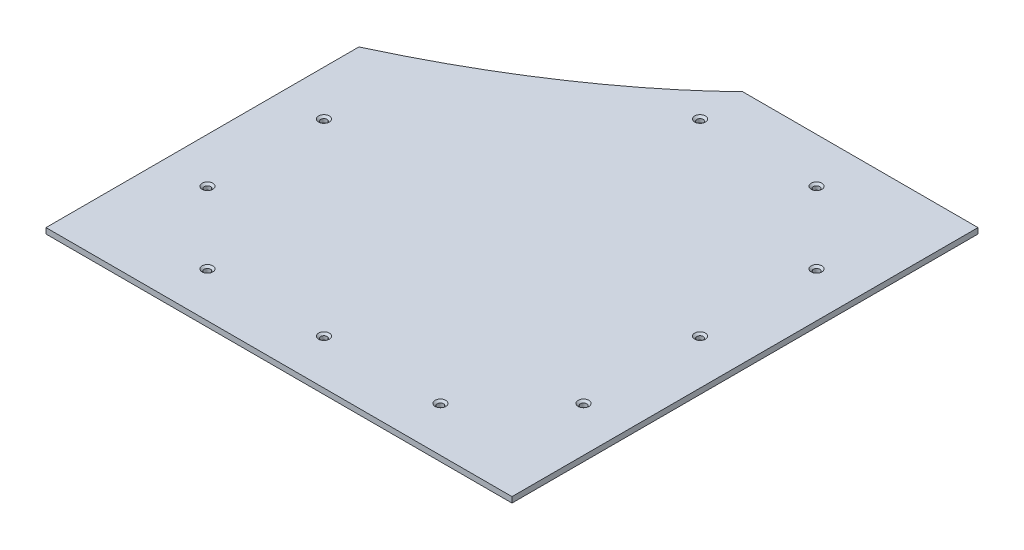
ISO-10303-21;
HEADER;
FILE_DESCRIPTION(('STEP AP214'),'2;1');
FILE_NAME('part.step','',(''),(''),'','','');
FILE_SCHEMA(('AUTOMOTIVE_DESIGN { 1 0 10303 214 1 1 1 1 }'));
ENDSEC;
DATA;
#1=APPLICATION_CONTEXT('core data for automotive mechanical design processes');
#2=APPLICATION_PROTOCOL_DEFINITION('international standard','automotive_design',2000,#1);
#3=PRODUCT_CONTEXT('',#1,'mechanical');
#4=PRODUCT('Part','Part','',(#3));
#5=PRODUCT_RELATED_PRODUCT_CATEGORY('part','',(#4));
#6=PRODUCT_DEFINITION_FORMATION('','',#4);
#7=PRODUCT_DEFINITION_CONTEXT('part definition',#1,'design');
#8=PRODUCT_DEFINITION('design','',#6,#7);
#9=PRODUCT_DEFINITION_SHAPE('','',#8);
#10=(LENGTH_UNIT() NAMED_UNIT(*) SI_UNIT(.MILLI.,.METRE.));
#11=(NAMED_UNIT(*) PLANE_ANGLE_UNIT() SI_UNIT($,.RADIAN.));
#12=(NAMED_UNIT(*) SI_UNIT($,.STERADIAN.) SOLID_ANGLE_UNIT());
#13=UNCERTAINTY_MEASURE_WITH_UNIT(LENGTH_MEASURE(1.E-05),#10,'distance_accuracy_value','');
#14=(GEOMETRIC_REPRESENTATION_CONTEXT(3) GLOBAL_UNCERTAINTY_ASSIGNED_CONTEXT((#13)) GLOBAL_UNIT_ASSIGNED_CONTEXT((#10,
#11,#12)) REPRESENTATION_CONTEXT('',''));
#15=CARTESIAN_POINT('',(0.,0.,0.));
#16=DIRECTION('',(0.,0.,1.));
#17=DIRECTION('',(1.,0.,0.));
#18=AXIS2_PLACEMENT_3D('',#15,#16,#17);
#19=CARTESIAN_POINT('',(65.821179,76.933679,65.821179));
#20=DIRECTION('',(1.,0.,0.));
#21=DIRECTION('',(0.,0.,1.));
#22=AXIS2_PLACEMENT_3D('',#19,#20,#21);
#23=PLANE('',#22);
#24=DIRECTION('',(0.,0.,1.));
#25=VECTOR('',#24,1.);
#26=CARTESIAN_POINT('',(65.821179,75.346179,65.821179));
#27=LINE('',#26,#25);
#28=CARTESIAN_POINT('',(65.821179,75.346179,-65.821179));
#29=VERTEX_POINT('',#28);
#30=CARTESIAN_POINT('',(65.821179,75.346179,65.821179));
#31=VERTEX_POINT('',#30);
#32=EDGE_CURVE('E103',#29,#31,#27,.T.);
#33=ORIENTED_EDGE('',*,*,#32,.F.);
#34=DIRECTION('',(0.,-1.,0.));
#35=VECTOR('',#34,1.);
#36=CARTESIAN_POINT('',(65.821179,76.933679,-65.821179));
#37=LINE('',#36,#35);
#38=CARTESIAN_POINT('',(65.821179,76.933679,-65.821179));
#39=VERTEX_POINT('',#38);
#40=EDGE_CURVE('E39',#39,#29,#37,.T.);
#41=ORIENTED_EDGE('',*,*,#40,.F.);
#42=DIRECTION('',(0.,0.,1.));
#43=VECTOR('',#42,1.);
#44=CARTESIAN_POINT('',(65.821179,76.933679,65.821179));
#45=LINE('',#44,#43);
#46=CARTESIAN_POINT('',(65.821179,76.933679,65.821179));
#47=VERTEX_POINT('',#46);
#48=EDGE_CURVE('E101',#39,#47,#45,.T.);
#49=ORIENTED_EDGE('',*,*,#48,.T.);
#50=DIRECTION('',(0.,-1.,0.));
#51=VECTOR('',#50,1.);
#52=CARTESIAN_POINT('',(65.821179,76.933679,65.821179));
#53=LINE('',#52,#51);
#54=EDGE_CURVE('E76',#47,#31,#53,.T.);
#55=ORIENTED_EDGE('',*,*,#54,.T.);
#56=EDGE_LOOP('',(#33,#41,#49,#55));
#57=FACE_BOUND('',#56,.T.);
#58=ADVANCED_FACE('F32',(#57),#23,.T.);
#59=CARTESIAN_POINT('',(65.821179,76.933679,-65.821179));
#60=DIRECTION('',(0.,0.,-1.));
#61=DIRECTION('',(1.,0.,0.));
#62=AXIS2_PLACEMENT_3D('',#59,#60,#61);
#63=PLANE('',#62);
#64=CARTESIAN_POINT('',(-78.4121172748223,76.165561457065,-65.821179));
#65=DIRECTION('',(0.,0.,-1.));
#66=DIRECTION('',(0.896707047194472,0.442624526559217,0.));
#67=AXIS2_PLACEMENT_3D('',#64,#65,#66);
#68=ELLIPSE('',#67,107.554363776842,44.45);
#69=CARTESIAN_POINT('',(-0.660591825935017,76.933679,-65.821179));
#70=VERTEX_POINT('',#69);
#71=CARTESIAN_POINT('',(-2.22918076828221,75.346179,-65.821179));
#72=VERTEX_POINT('',#71);
#73=EDGE_CURVE('E46',#70,#72,#68,.T.);
#74=ORIENTED_EDGE('',*,*,#73,.F.);
#75=DIRECTION('',(1.,0.,0.));
#76=VECTOR('',#75,1.);
#77=CARTESIAN_POINT('',(65.821179,76.933679,-65.821179));
#78=LINE('',#77,#76);
#79=EDGE_CURVE('E53',#70,#39,#78,.T.);
#80=ORIENTED_EDGE('',*,*,#79,.T.);
#81=ORIENTED_EDGE('',*,*,#40,.T.);
#82=DIRECTION('',(1.,0.,0.));
#83=VECTOR('',#82,1.);
#84=CARTESIAN_POINT('',(65.821179,75.346179,-65.821179));
#85=LINE('',#84,#83);
#86=EDGE_CURVE('E71',#72,#29,#85,.T.);
#87=ORIENTED_EDGE('',*,*,#86,.F.);
#88=EDGE_LOOP('',(#74,#80,#81,#87));
#89=FACE_BOUND('',#88,.T.);
#90=ADVANCED_FACE('F132',(#89),#63,.T.);
#91=CARTESIAN_POINT('',(-65.821179,76.933679,65.821179));
#92=DIRECTION('',(-1.,0.,0.));
#93=DIRECTION('',(0.,0.,-1.));
#94=AXIS2_PLACEMENT_3D('',#91,#92,#93);
#95=PLANE('',#94);
#96=CARTESIAN_POINT('',(-65.821179,82.3805879925049,-72.1938508100711));
#97=DIRECTION('',(-1.,0.,0.));
#98=DIRECTION('',(0.,0.698196395740358,-0.715906273876108));
#99=AXIS2_PLACEMENT_3D('',#96,#97,#98);
#100=ELLIPSE('',#99,54.4366628705828,44.45);
#101=CARTESIAN_POINT('',(-65.821179,75.346179,-22.4609990980805));
#102=VERTEX_POINT('',#101);
#103=CARTESIAN_POINT('',(-65.821179,76.933679,-22.5814922659836));
#104=VERTEX_POINT('',#103);
#105=EDGE_CURVE('E86',#102,#104,#100,.T.);
#106=ORIENTED_EDGE('',*,*,#105,.F.);
#107=DIRECTION('',(0.,0.,-1.));
#108=VECTOR('',#107,1.);
#109=CARTESIAN_POINT('',(-65.821179,75.346179,65.821179));
#110=LINE('',#109,#108);
#111=CARTESIAN_POINT('',(-65.821179,75.346179,65.821179));
#112=VERTEX_POINT('',#111);
#113=EDGE_CURVE('E93',#112,#102,#110,.T.);
#114=ORIENTED_EDGE('',*,*,#113,.F.);
#115=DIRECTION('',(0.,-1.,0.));
#116=VECTOR('',#115,1.);
#117=CARTESIAN_POINT('',(-65.821179,76.933679,65.821179));
#118=LINE('',#117,#116);
#119=CARTESIAN_POINT('',(-65.821179,76.933679,65.821179));
#120=VERTEX_POINT('',#119);
#121=EDGE_CURVE('E108',#120,#112,#118,.T.);
#122=ORIENTED_EDGE('',*,*,#121,.F.);
#123=DIRECTION('',(0.,0.,-1.));
#124=VECTOR('',#123,1.);
#125=CARTESIAN_POINT('',(-65.821179,76.933679,65.821179));
#126=LINE('',#125,#124);
#127=EDGE_CURVE('E96',#120,#104,#126,.T.);
#128=ORIENTED_EDGE('',*,*,#127,.T.);
#129=EDGE_LOOP('',(#106,#114,#122,#128));
#130=FACE_BOUND('',#129,.T.);
#131=ADVANCED_FACE('F92',(#130),#95,.T.);
#132=CARTESIAN_POINT('',(65.821179,76.933679,65.821179));
#133=DIRECTION('',(0.,0.,1.));
#134=DIRECTION('',(-1.,0.,0.));
#135=AXIS2_PLACEMENT_3D('',#132,#133,#134);
#136=PLANE('',#135);
#137=DIRECTION('',(-1.,0.,0.));
#138=VECTOR('',#137,1.);
#139=CARTESIAN_POINT('',(65.821179,75.346179,65.821179));
#140=LINE('',#139,#138);
#141=EDGE_CURVE('E99',#31,#112,#140,.T.);
#142=ORIENTED_EDGE('',*,*,#141,.F.);
#143=ORIENTED_EDGE('',*,*,#54,.F.);
#144=DIRECTION('',(-1.,0.,0.));
#145=VECTOR('',#144,1.);
#146=CARTESIAN_POINT('',(65.821179,76.933679,65.821179));
#147=LINE('',#146,#145);
#148=EDGE_CURVE('E113',#47,#120,#147,.T.);
#149=ORIENTED_EDGE('',*,*,#148,.T.);
#150=ORIENTED_EDGE('',*,*,#121,.T.);
#151=EDGE_LOOP('',(#142,#143,#149,#150));
#152=FACE_BOUND('',#151,.T.);
#153=ADVANCED_FACE('F127',(#152),#136,.T.);
#154=CARTESIAN_POINT('',(65.821179,76.933679,-65.821179));
#155=DIRECTION('',(0.,1.,0.));
#156=DIRECTION('',(0.,0.,-1.));
#157=AXIS2_PLACEMENT_3D('',#154,#155,#156);
#158=PLANE('',#157);
#159=CARTESIAN_POINT('',(-76.8559983241222,76.933679,-66.6087799836434));
#160=DIRECTION('',(0.,1.,0.));
#161=DIRECTION('',(0.892228166379723,0.,-0.451584874767388));
#162=AXIS2_PLACEMENT_3D('',#159,#160,#161);
#163=ELLIPSE('',#162,110.282499709764,44.45);
#164=EDGE_CURVE('E133',#104,#70,#163,.T.);
#165=ORIENTED_EDGE('',*,*,#164,.F.);
#166=ORIENTED_EDGE('',*,*,#127,.F.);
#167=ORIENTED_EDGE('',*,*,#148,.F.);
#168=ORIENTED_EDGE('',*,*,#48,.F.);
#169=ORIENTED_EDGE('',*,*,#79,.F.);
#170=EDGE_LOOP('',(#165,#166,#167,#168,#169));
#171=FACE_BOUND('',#170,.T.);
#172=CARTESIAN_POINT('',(-53.1211790000003,76.933679,32.9105894999995));
#173=DIRECTION('',(0.,1.,0.));
#174=DIRECTION('',(0.,0.,-1.));
#175=AXIS2_PLACEMENT_3D('',#172,#173,#174);
#176=CIRCLE('',#175,1.5113);
#177=CARTESIAN_POINT('',(-53.1211790000003,76.933679,31.3992894999995));
#178=VERTEX_POINT('',#177);
#179=EDGE_CURVE('E135',#178,#178,#176,.T.);
#180=ORIENTED_EDGE('',*,*,#179,.F.);
#181=EDGE_LOOP('',(#180));
#182=FACE_BOUND('',#181,.T.);
#183=CARTESIAN_POINT('',(-53.121179,76.933679,-5.54508773728232E-13));
#184=DIRECTION('',(0.,1.,0.));
#185=DIRECTION('',(0.,0.,-1.));
#186=AXIS2_PLACEMENT_3D('',#183,#184,#185);
#187=CIRCLE('',#186,1.5113);
#188=CARTESIAN_POINT('',(-53.121179,76.933679,-1.51130000000055));
#189=VERTEX_POINT('',#188);
#190=EDGE_CURVE('E146',#189,#189,#187,.T.);
#191=ORIENTED_EDGE('',*,*,#190,.F.);
#192=EDGE_LOOP('',(#191));
#193=FACE_BOUND('',#192,.T.);
#194=CARTESIAN_POINT('',(32.9105894999996,76.933679,53.1211790000002));
#195=DIRECTION('',(0.,1.,0.));
#196=DIRECTION('',(0.,0.,-1.));
#197=AXIS2_PLACEMENT_3D('',#194,#195,#196);
#198=CIRCLE('',#197,1.5113);
#199=CARTESIAN_POINT('',(32.9105894999996,76.933679,51.6098790000002));
#200=VERTEX_POINT('',#199);
#201=EDGE_CURVE('E155',#200,#200,#198,.T.);
#202=ORIENTED_EDGE('',*,*,#201,.F.);
#203=EDGE_LOOP('',(#202));
#204=FACE_BOUND('',#203,.T.);
#205=CARTESIAN_POINT('',(-3.69037061127219E-13,76.933679,53.121179));
#206=DIRECTION('',(0.,1.,0.));
#207=DIRECTION('',(0.,0.,-1.));
#208=AXIS2_PLACEMENT_3D('',#205,#206,#207);
#209=CIRCLE('',#208,1.5113);
#210=CARTESIAN_POINT('',(-3.69037061127219E-13,76.933679,51.609879));
#211=VERTEX_POINT('',#210);
#212=EDGE_CURVE('E164',#211,#211,#209,.T.);
#213=ORIENTED_EDGE('',*,*,#212,.F.);
#214=EDGE_LOOP('',(#213));
#215=FACE_BOUND('',#214,.T.);
#216=CARTESIAN_POINT('',(-32.9105895000004,76.933679,53.1211789999997));
#217=DIRECTION('',(0.,1.,0.));
#218=DIRECTION('',(0.,0.,-1.));
#219=AXIS2_PLACEMENT_3D('',#216,#217,#218);
#220=CIRCLE('',#219,1.5113);
#221=CARTESIAN_POINT('',(-32.9105895000004,76.933679,51.6098789999997));
#222=VERTEX_POINT('',#221);
#223=EDGE_CURVE('E173',#222,#222,#220,.T.);
#224=ORIENTED_EDGE('',*,*,#223,.F.);
#225=EDGE_LOOP('',(#224));
#226=FACE_BOUND('',#225,.T.);
#227=CARTESIAN_POINT('',(53.1211790000001,76.933679,-32.9105894999998));
#228=DIRECTION('',(0.,1.,0.));
#229=DIRECTION('',(0.,0.,-1.));
#230=AXIS2_PLACEMENT_3D('',#227,#228,#229);
#231=CIRCLE('',#230,1.5113);
#232=CARTESIAN_POINT('',(53.1211790000001,76.933679,-34.4218894999998));
#233=VERTEX_POINT('',#232);
#234=EDGE_CURVE('E182',#233,#233,#231,.T.);
#235=ORIENTED_EDGE('',*,*,#234,.F.);
#236=EDGE_LOOP('',(#235));
#237=FACE_BOUND('',#236,.T.);
#238=CARTESIAN_POINT('',(53.121179,76.933679,1.83565348526206E-13));
#239=DIRECTION('',(0.,1.,0.));
#240=DIRECTION('',(0.,0.,-1.));
#241=AXIS2_PLACEMENT_3D('',#238,#239,#240);
#242=CIRCLE('',#241,1.5113);
#243=CARTESIAN_POINT('',(53.121179,76.933679,-1.51129999999982));
#244=VERTEX_POINT('',#243);
#245=EDGE_CURVE('E191',#244,#244,#242,.T.);
#246=ORIENTED_EDGE('',*,*,#245,.F.);
#247=EDGE_LOOP('',(#246));
#248=FACE_BOUND('',#247,.T.);
#249=CARTESIAN_POINT('',(53.1211789999998,76.933679,32.9105895000002));
#250=DIRECTION('',(0.,1.,0.));
#251=DIRECTION('',(0.,0.,-1.));
#252=AXIS2_PLACEMENT_3D('',#249,#250,#251);
#253=CIRCLE('',#252,1.5113);
#254=CARTESIAN_POINT('',(53.1211789999998,76.933679,31.3992895000002));
#255=VERTEX_POINT('',#254);
#256=EDGE_CURVE('E200',#255,#255,#253,.T.);
#257=ORIENTED_EDGE('',*,*,#256,.F.);
#258=EDGE_LOOP('',(#257));
#259=FACE_BOUND('',#258,.T.);
#260=CARTESIAN_POINT('',(0.,76.933679,-53.121179));
#261=DIRECTION('',(0.,1.,0.));
#262=DIRECTION('',(0.,0.,-1.));
#263=AXIS2_PLACEMENT_3D('',#260,#261,#262);
#264=CIRCLE('',#263,1.5113);
#265=CARTESIAN_POINT('',(0.,76.933679,-54.632479));
#266=VERTEX_POINT('',#265);
#267=EDGE_CURVE('E209',#266,#266,#264,.T.);
#268=ORIENTED_EDGE('',*,*,#267,.F.);
#269=EDGE_LOOP('',(#268));
#270=FACE_BOUND('',#269,.T.);
#271=CARTESIAN_POINT('',(32.9105895,76.933679,-53.121179));
#272=DIRECTION('',(0.,1.,0.));
#273=DIRECTION('',(0.,0.,-1.));
#274=AXIS2_PLACEMENT_3D('',#271,#272,#273);
#275=CIRCLE('',#274,1.5113);
#276=CARTESIAN_POINT('',(32.9105895,76.933679,-54.632479));
#277=VERTEX_POINT('',#276);
#278=EDGE_CURVE('E123',#277,#277,#275,.T.);
#279=ORIENTED_EDGE('',*,*,#278,.F.);
#280=EDGE_LOOP('',(#279));
#281=FACE_BOUND('',#280,.T.);
#282=ADVANCED_FACE('F130',(#171,#182,#193,#204,#215,#226,#237,#248,#259,#270,#281),#158,.T.);
#283=CARTESIAN_POINT('',(65.821179,75.346179,-65.821179));
#284=DIRECTION('',(0.,1.,0.));
#285=DIRECTION('',(0.,0.,-1.));
#286=AXIS2_PLACEMENT_3D('',#283,#284,#285);
#287=PLANE('',#286);
#288=CARTESIAN_POINT('',(-53.1211790000003,75.346179,32.9105894999995));
#289=DIRECTION('',(0.,1.,0.));
#290=DIRECTION('',(0.,0.,-1.));
#291=AXIS2_PLACEMENT_3D('',#288,#289,#290);
#292=CIRCLE('',#291,0.889000000000001);
#293=CARTESIAN_POINT('',(-53.1211790000003,75.346179,32.0215894999995));
#294=VERTEX_POINT('',#293);
#295=EDGE_CURVE('E143',#294,#294,#292,.T.);
#296=ORIENTED_EDGE('',*,*,#295,.T.);
#297=EDGE_LOOP('',(#296));
#298=FACE_BOUND('',#297,.T.);
#299=CARTESIAN_POINT('',(-53.121179,75.346179,-5.54508773728232E-13));
#300=DIRECTION('',(0.,1.,0.));
#301=DIRECTION('',(0.,0.,-1.));
#302=AXIS2_PLACEMENT_3D('',#299,#300,#301);
#303=CIRCLE('',#302,0.889000000000001);
#304=CARTESIAN_POINT('',(-53.121179,75.346179,-0.889000000000556));
#305=VERTEX_POINT('',#304);
#306=EDGE_CURVE('E152',#305,#305,#303,.T.);
#307=ORIENTED_EDGE('',*,*,#306,.T.);
#308=EDGE_LOOP('',(#307));
#309=FACE_BOUND('',#308,.T.);
#310=CARTESIAN_POINT('',(32.9105894999996,75.346179,53.1211790000002));
#311=DIRECTION('',(0.,1.,0.));
#312=DIRECTION('',(0.,0.,-1.));
#313=AXIS2_PLACEMENT_3D('',#310,#311,#312);
#314=CIRCLE('',#313,0.889000000000001);
#315=CARTESIAN_POINT('',(32.9105894999996,75.346179,52.2321790000002));
#316=VERTEX_POINT('',#315);
#317=EDGE_CURVE('E161',#316,#316,#314,.T.);
#318=ORIENTED_EDGE('',*,*,#317,.T.);
#319=EDGE_LOOP('',(#318));
#320=FACE_BOUND('',#319,.T.);
#321=CARTESIAN_POINT('',(-3.69037061127219E-13,75.346179,53.121179));
#322=DIRECTION('',(0.,1.,0.));
#323=DIRECTION('',(0.,0.,-1.));
#324=AXIS2_PLACEMENT_3D('',#321,#322,#323);
#325=CIRCLE('',#324,0.889);
#326=CARTESIAN_POINT('',(-3.69037061127219E-13,75.346179,52.232179));
#327=VERTEX_POINT('',#326);
#328=EDGE_CURVE('E170',#327,#327,#325,.T.);
#329=ORIENTED_EDGE('',*,*,#328,.T.);
#330=EDGE_LOOP('',(#329));
#331=FACE_BOUND('',#330,.T.);
#332=CARTESIAN_POINT('',(-32.9105895000004,75.346179,53.1211789999997));
#333=DIRECTION('',(0.,1.,0.));
#334=DIRECTION('',(0.,0.,-1.));
#335=AXIS2_PLACEMENT_3D('',#332,#333,#334);
#336=CIRCLE('',#335,0.889000000000001);
#337=CARTESIAN_POINT('',(-32.9105895000004,75.346179,52.2321789999997));
#338=VERTEX_POINT('',#337);
#339=EDGE_CURVE('E179',#338,#338,#336,.T.);
#340=ORIENTED_EDGE('',*,*,#339,.T.);
#341=EDGE_LOOP('',(#340));
#342=FACE_BOUND('',#341,.T.);
#343=CARTESIAN_POINT('',(53.1211790000001,75.346179,-32.9105894999998));
#344=DIRECTION('',(0.,1.,0.));
#345=DIRECTION('',(0.,0.,-1.));
#346=AXIS2_PLACEMENT_3D('',#343,#344,#345);
#347=CIRCLE('',#346,0.889000000000001);
#348=CARTESIAN_POINT('',(53.1211790000001,75.346179,-33.7995894999998));
#349=VERTEX_POINT('',#348);
#350=EDGE_CURVE('E188',#349,#349,#347,.T.);
#351=ORIENTED_EDGE('',*,*,#350,.T.);
#352=EDGE_LOOP('',(#351));
#353=FACE_BOUND('',#352,.T.);
#354=CARTESIAN_POINT('',(53.121179,75.346179,1.83565348526206E-13));
#355=DIRECTION('',(0.,1.,0.));
#356=DIRECTION('',(0.,0.,-1.));
#357=AXIS2_PLACEMENT_3D('',#354,#355,#356);
#358=CIRCLE('',#357,0.889000000000001);
#359=CARTESIAN_POINT('',(53.121179,75.346179,-0.888999999999818));
#360=VERTEX_POINT('',#359);
#361=EDGE_CURVE('E197',#360,#360,#358,.T.);
#362=ORIENTED_EDGE('',*,*,#361,.T.);
#363=EDGE_LOOP('',(#362));
#364=FACE_BOUND('',#363,.T.);
#365=CARTESIAN_POINT('',(53.1211789999998,75.346179,32.9105895000002));
#366=DIRECTION('',(0.,1.,0.));
#367=DIRECTION('',(0.,0.,-1.));
#368=AXIS2_PLACEMENT_3D('',#365,#366,#367);
#369=CIRCLE('',#368,0.889000000000001);
#370=CARTESIAN_POINT('',(53.1211789999998,75.346179,32.0215895000002));
#371=VERTEX_POINT('',#370);
#372=EDGE_CURVE('E206',#371,#371,#369,.T.);
#373=ORIENTED_EDGE('',*,*,#372,.T.);
#374=EDGE_LOOP('',(#373));
#375=FACE_BOUND('',#374,.T.);
#376=CARTESIAN_POINT('',(0.,75.346179,-53.121179));
#377=DIRECTION('',(0.,1.,0.));
#378=DIRECTION('',(0.,0.,-1.));
#379=AXIS2_PLACEMENT_3D('',#376,#377,#378);
#380=CIRCLE('',#379,0.889);
#381=CARTESIAN_POINT('',(0.,75.346179,-54.010179));
#382=VERTEX_POINT('',#381);
#383=EDGE_CURVE('E215',#382,#382,#380,.T.);
#384=ORIENTED_EDGE('',*,*,#383,.T.);
#385=EDGE_LOOP('',(#384));
#386=FACE_BOUND('',#385,.T.);
#387=CARTESIAN_POINT('',(32.9105895,75.346179,-53.121179));
#388=DIRECTION('',(0.,1.,0.));
#389=DIRECTION('',(0.,0.,-1.));
#390=AXIS2_PLACEMENT_3D('',#387,#388,#389);
#391=CIRCLE('',#390,0.889000000000001);
#392=CARTESIAN_POINT('',(32.9105895,75.346179,-54.010179));
#393=VERTEX_POINT('',#392);
#394=EDGE_CURVE('E116',#393,#393,#391,.T.);
#395=ORIENTED_EDGE('',*,*,#394,.T.);
#396=EDGE_LOOP('',(#395));
#397=FACE_BOUND('',#396,.T.);
#398=ORIENTED_EDGE('',*,*,#113,.T.);
#399=CARTESIAN_POINT('',(-80.0720931223185,75.346179,-64.981012758387));
#400=DIRECTION('',(0.,1.,0.));
#401=DIRECTION('',(0.892228166379723,0.,-0.451584874767388));
#402=AXIS2_PLACEMENT_3D('',#399,#400,#401);
#403=ELLIPSE('',#402,110.282499709764,44.45);
#404=EDGE_CURVE('E11',#102,#72,#403,.T.);
#405=ORIENTED_EDGE('',*,*,#404,.T.);
#406=ORIENTED_EDGE('',*,*,#86,.T.);
#407=ORIENTED_EDGE('',*,*,#32,.T.);
#408=ORIENTED_EDGE('',*,*,#141,.T.);
#409=EDGE_LOOP('',(#398,#405,#406,#407,#408));
#410=FACE_BOUND('',#409,.T.);
#411=ADVANCED_FACE('F98',(#298,#309,#320,#331,#342,#353,#364,#375,#386,#397,#410),#287,.F.);
#412=CARTESIAN_POINT('',(32.9105895,76.933679,-53.121179));
#413=DIRECTION('',(0.,1.,0.));
#414=DIRECTION('',(0.,0.,-1.));
#415=AXIS2_PLACEMENT_3D('',#412,#413,#414);
#416=CYLINDRICAL_SURFACE('',#415,0.888999999999997);
#417=ORIENTED_EDGE('',*,*,#394,.F.);
#418=EDGE_LOOP('',(#417));
#419=FACE_BOUND('',#418,.T.);
#420=CARTESIAN_POINT('',(32.9105895,76.4115072995184,-53.121179));
#421=DIRECTION('',(0.,1.,0.));
#422=DIRECTION('',(0.,0.,-1.));
#423=AXIS2_PLACEMENT_3D('',#420,#421,#422);
#424=CIRCLE('',#423,0.888999999999994);
#425=CARTESIAN_POINT('',(32.9105895,76.4115072995184,-54.010179));
#426=VERTEX_POINT('',#425);
#427=EDGE_CURVE('E118',#426,#426,#424,.T.);
#428=ORIENTED_EDGE('',*,*,#427,.T.);
#429=EDGE_LOOP('',(#428));
#430=FACE_BOUND('',#429,.T.);
#431=ADVANCED_FACE('F228',(#419,#430),#416,.F.);
#432=CARTESIAN_POINT('',(32.9105895,76.933679,-53.121179));
#433=DIRECTION('',(0.,1.,0.));
#434=DIRECTION('',(0.,0.,-1.));
#435=AXIS2_PLACEMENT_3D('',#432,#433,#434);
#436=CONICAL_SURFACE('',#435,1.5113,0.872664625997172);
#437=ORIENTED_EDGE('',*,*,#427,.F.);
#438=EDGE_LOOP('',(#437));
#439=FACE_BOUND('',#438,.T.);
#440=ORIENTED_EDGE('',*,*,#278,.T.);
#441=EDGE_LOOP('',(#440));
#442=FACE_BOUND('',#441,.T.);
#443=ADVANCED_FACE('F220',(#439,#442),#436,.F.);
#444=CARTESIAN_POINT('',(0.,76.933679,-53.121179));
#445=DIRECTION('',(0.,1.,0.));
#446=DIRECTION('',(0.,0.,-1.));
#447=AXIS2_PLACEMENT_3D('',#444,#445,#446);
#448=CYLINDRICAL_SURFACE('',#447,0.888999999999998);
#449=ORIENTED_EDGE('',*,*,#383,.F.);
#450=EDGE_LOOP('',(#449));
#451=FACE_BOUND('',#450,.T.);
#452=CARTESIAN_POINT('',(0.,76.4115072995184,-53.121179));
#453=DIRECTION('',(0.,1.,0.));
#454=DIRECTION('',(0.,0.,-1.));
#455=AXIS2_PLACEMENT_3D('',#452,#453,#454);
#456=CIRCLE('',#455,0.888999999999997);
#457=CARTESIAN_POINT('',(0.,76.4115072995184,-54.010179));
#458=VERTEX_POINT('',#457);
#459=EDGE_CURVE('E212',#458,#458,#456,.T.);
#460=ORIENTED_EDGE('',*,*,#459,.T.);
#461=EDGE_LOOP('',(#460));
#462=FACE_BOUND('',#461,.T.);
#463=ADVANCED_FACE('F268',(#451,#462),#448,.F.);
#464=CARTESIAN_POINT('',(0.,76.933679,-53.121179));
#465=DIRECTION('',(0.,1.,0.));
#466=DIRECTION('',(0.,0.,-1.));
#467=AXIS2_PLACEMENT_3D('',#464,#465,#466);
#468=CONICAL_SURFACE('',#467,1.5113,0.87266462599717);
#469=ORIENTED_EDGE('',*,*,#459,.F.);
#470=EDGE_LOOP('',(#469));
#471=FACE_BOUND('',#470,.T.);
#472=ORIENTED_EDGE('',*,*,#267,.T.);
#473=EDGE_LOOP('',(#472));
#474=FACE_BOUND('',#473,.T.);
#475=ADVANCED_FACE('F278',(#471,#474),#468,.F.);
#476=CARTESIAN_POINT('',(53.1211789999998,76.933679,32.9105895000002));
#477=DIRECTION('',(0.,1.,0.));
#478=DIRECTION('',(0.,0.,-1.));
#479=AXIS2_PLACEMENT_3D('',#476,#477,#478);
#480=CYLINDRICAL_SURFACE('',#479,0.888999999999997);
#481=ORIENTED_EDGE('',*,*,#372,.F.);
#482=EDGE_LOOP('',(#481));
#483=FACE_BOUND('',#482,.T.);
#484=CARTESIAN_POINT('',(53.1211789999998,76.4115072995184,32.9105895000002));
#485=DIRECTION('',(0.,1.,0.));
#486=DIRECTION('',(0.,0.,-1.));
#487=AXIS2_PLACEMENT_3D('',#484,#485,#486);
#488=CIRCLE('',#487,0.888999999999994);
#489=CARTESIAN_POINT('',(53.1211789999998,76.4115072995184,32.0215895000002));
#490=VERTEX_POINT('',#489);
#491=EDGE_CURVE('E203',#490,#490,#488,.T.);
#492=ORIENTED_EDGE('',*,*,#491,.T.);
#493=EDGE_LOOP('',(#492));
#494=FACE_BOUND('',#493,.T.);
#495=ADVANCED_FACE('F288',(#483,#494),#480,.F.);
#496=CARTESIAN_POINT('',(53.1211789999998,76.933679,32.9105895000002));
#497=DIRECTION('',(0.,1.,0.));
#498=DIRECTION('',(0.,0.,-1.));
#499=AXIS2_PLACEMENT_3D('',#496,#497,#498);
#500=CONICAL_SURFACE('',#499,1.5113,0.872664625997172);
#501=ORIENTED_EDGE('',*,*,#491,.F.);
#502=EDGE_LOOP('',(#501));
#503=FACE_BOUND('',#502,.T.);
#504=ORIENTED_EDGE('',*,*,#256,.T.);
#505=EDGE_LOOP('',(#504));
#506=FACE_BOUND('',#505,.T.);
#507=ADVANCED_FACE('F298',(#503,#506),#500,.F.);
#508=CARTESIAN_POINT('',(53.121179,76.933679,1.83565348526206E-13));
#509=DIRECTION('',(0.,1.,0.));
#510=DIRECTION('',(0.,0.,-1.));
#511=AXIS2_PLACEMENT_3D('',#508,#509,#510);
#512=CYLINDRICAL_SURFACE('',#511,0.888999999999997);
#513=ORIENTED_EDGE('',*,*,#361,.F.);
#514=EDGE_LOOP('',(#513));
#515=FACE_BOUND('',#514,.T.);
#516=CARTESIAN_POINT('',(53.121179,76.4115072995184,1.83565348526206E-13));
#517=DIRECTION('',(0.,1.,0.));
#518=DIRECTION('',(0.,0.,-1.));
#519=AXIS2_PLACEMENT_3D('',#516,#517,#518);
#520=CIRCLE('',#519,0.888999999999994);
#521=CARTESIAN_POINT('',(53.121179,76.4115072995184,-0.888999999999811));
#522=VERTEX_POINT('',#521);
#523=EDGE_CURVE('E194',#522,#522,#520,.T.);
#524=ORIENTED_EDGE('',*,*,#523,.T.);
#525=EDGE_LOOP('',(#524));
#526=FACE_BOUND('',#525,.T.);
#527=ADVANCED_FACE('F308',(#515,#526),#512,.F.);
#528=CARTESIAN_POINT('',(53.121179,76.933679,1.83565348526206E-13));
#529=DIRECTION('',(0.,1.,0.));
#530=DIRECTION('',(0.,0.,-1.));
#531=AXIS2_PLACEMENT_3D('',#528,#529,#530);
#532=CONICAL_SURFACE('',#531,1.5113,0.872664625997172);
#533=ORIENTED_EDGE('',*,*,#523,.F.);
#534=EDGE_LOOP('',(#533));
#535=FACE_BOUND('',#534,.T.);
#536=ORIENTED_EDGE('',*,*,#245,.T.);
#537=EDGE_LOOP('',(#536));
#538=FACE_BOUND('',#537,.T.);
#539=ADVANCED_FACE('F318',(#535,#538),#532,.F.);
#540=CARTESIAN_POINT('',(53.1211790000001,76.933679,-32.9105894999998));
#541=DIRECTION('',(0.,1.,0.));
#542=DIRECTION('',(0.,0.,-1.));
#543=AXIS2_PLACEMENT_3D('',#540,#541,#542);
#544=CYLINDRICAL_SURFACE('',#543,0.888999999999997);
#545=ORIENTED_EDGE('',*,*,#350,.F.);
#546=EDGE_LOOP('',(#545));
#547=FACE_BOUND('',#546,.T.);
#548=CARTESIAN_POINT('',(53.1211790000001,76.4115072995184,-32.9105894999998));
#549=DIRECTION('',(0.,1.,0.));
#550=DIRECTION('',(0.,0.,-1.));
#551=AXIS2_PLACEMENT_3D('',#548,#549,#550);
#552=CIRCLE('',#551,0.888999999999994);
#553=CARTESIAN_POINT('',(53.1211790000001,76.4115072995184,-33.7995894999998));
#554=VERTEX_POINT('',#553);
#555=EDGE_CURVE('E185',#554,#554,#552,.T.);
#556=ORIENTED_EDGE('',*,*,#555,.T.);
#557=EDGE_LOOP('',(#556));
#558=FACE_BOUND('',#557,.T.);
#559=ADVANCED_FACE('F328',(#547,#558),#544,.F.);
#560=CARTESIAN_POINT('',(53.1211790000001,76.933679,-32.9105894999998));
#561=DIRECTION('',(0.,1.,0.));
#562=DIRECTION('',(0.,0.,-1.));
#563=AXIS2_PLACEMENT_3D('',#560,#561,#562);
#564=CONICAL_SURFACE('',#563,1.5113,0.872664625997172);
#565=ORIENTED_EDGE('',*,*,#555,.F.);
#566=EDGE_LOOP('',(#565));
#567=FACE_BOUND('',#566,.T.);
#568=ORIENTED_EDGE('',*,*,#234,.T.);
#569=EDGE_LOOP('',(#568));
#570=FACE_BOUND('',#569,.T.);
#571=ADVANCED_FACE('F338',(#567,#570),#564,.F.);
#572=CARTESIAN_POINT('',(-32.9105895000004,76.933679,53.1211789999997));
#573=DIRECTION('',(0.,1.,0.));
#574=DIRECTION('',(0.,0.,-1.));
#575=AXIS2_PLACEMENT_3D('',#572,#573,#574);
#576=CYLINDRICAL_SURFACE('',#575,0.888999999999997);
#577=ORIENTED_EDGE('',*,*,#339,.F.);
#578=EDGE_LOOP('',(#577));
#579=FACE_BOUND('',#578,.T.);
#580=CARTESIAN_POINT('',(-32.9105895000004,76.4115072995184,53.1211789999997));
#581=DIRECTION('',(0.,1.,0.));
#582=DIRECTION('',(0.,0.,-1.));
#583=AXIS2_PLACEMENT_3D('',#580,#581,#582);
#584=CIRCLE('',#583,0.888999999999994);
#585=CARTESIAN_POINT('',(-32.9105895000004,76.4115072995184,52.2321789999997));
#586=VERTEX_POINT('',#585);
#587=EDGE_CURVE('E176',#586,#586,#584,.T.);
#588=ORIENTED_EDGE('',*,*,#587,.T.);
#589=EDGE_LOOP('',(#588));
#590=FACE_BOUND('',#589,.T.);
#591=ADVANCED_FACE('F348',(#579,#590),#576,.F.);
#592=CARTESIAN_POINT('',(-32.9105895000004,76.933679,53.1211789999997));
#593=DIRECTION('',(0.,1.,0.));
#594=DIRECTION('',(0.,0.,-1.));
#595=AXIS2_PLACEMENT_3D('',#592,#593,#594);
#596=CONICAL_SURFACE('',#595,1.5113,0.872664625997172);
#597=ORIENTED_EDGE('',*,*,#587,.F.);
#598=EDGE_LOOP('',(#597));
#599=FACE_BOUND('',#598,.T.);
#600=ORIENTED_EDGE('',*,*,#223,.T.);
#601=EDGE_LOOP('',(#600));
#602=FACE_BOUND('',#601,.T.);
#603=ADVANCED_FACE('F358',(#599,#602),#596,.F.);
#604=CARTESIAN_POINT('',(-3.69037061127219E-13,76.933679,53.121179));
#605=DIRECTION('',(0.,1.,0.));
#606=DIRECTION('',(0.,0.,-1.));
#607=AXIS2_PLACEMENT_3D('',#604,#605,#606);
#608=CYLINDRICAL_SURFACE('',#607,0.888999999999998);
#609=ORIENTED_EDGE('',*,*,#328,.F.);
#610=EDGE_LOOP('',(#609));
#611=FACE_BOUND('',#610,.T.);
#612=CARTESIAN_POINT('',(-3.69037061127219E-13,76.4115072995184,53.121179));
#613=DIRECTION('',(0.,1.,0.));
#614=DIRECTION('',(0.,0.,-1.));
#615=AXIS2_PLACEMENT_3D('',#612,#613,#614);
#616=CIRCLE('',#615,0.888999999999997);
#617=CARTESIAN_POINT('',(-3.69037061127219E-13,76.4115072995184,52.232179));
#618=VERTEX_POINT('',#617);
#619=EDGE_CURVE('E167',#618,#618,#616,.T.);
#620=ORIENTED_EDGE('',*,*,#619,.T.);
#621=EDGE_LOOP('',(#620));
#622=FACE_BOUND('',#621,.T.);
#623=ADVANCED_FACE('F368',(#611,#622),#608,.F.);
#624=CARTESIAN_POINT('',(-3.69037061127219E-13,76.933679,53.121179));
#625=DIRECTION('',(0.,1.,0.));
#626=DIRECTION('',(0.,0.,-1.));
#627=AXIS2_PLACEMENT_3D('',#624,#625,#626);
#628=CONICAL_SURFACE('',#627,1.5113,0.87266462599717);
#629=ORIENTED_EDGE('',*,*,#619,.F.);
#630=EDGE_LOOP('',(#629));
#631=FACE_BOUND('',#630,.T.);
#632=ORIENTED_EDGE('',*,*,#212,.T.);
#633=EDGE_LOOP('',(#632));
#634=FACE_BOUND('',#633,.T.);
#635=ADVANCED_FACE('F378',(#631,#634),#628,.F.);
#636=CARTESIAN_POINT('',(32.9105894999996,76.933679,53.1211790000002));
#637=DIRECTION('',(0.,1.,0.));
#638=DIRECTION('',(0.,0.,-1.));
#639=AXIS2_PLACEMENT_3D('',#636,#637,#638);
#640=CYLINDRICAL_SURFACE('',#639,0.888999999999997);
#641=ORIENTED_EDGE('',*,*,#317,.F.);
#642=EDGE_LOOP('',(#641));
#643=FACE_BOUND('',#642,.T.);
#644=CARTESIAN_POINT('',(32.9105894999996,76.4115072995184,53.1211790000002));
#645=DIRECTION('',(0.,1.,0.));
#646=DIRECTION('',(0.,0.,-1.));
#647=AXIS2_PLACEMENT_3D('',#644,#645,#646);
#648=CIRCLE('',#647,0.888999999999994);
#649=CARTESIAN_POINT('',(32.9105894999996,76.4115072995184,52.2321790000002));
#650=VERTEX_POINT('',#649);
#651=EDGE_CURVE('E158',#650,#650,#648,.T.);
#652=ORIENTED_EDGE('',*,*,#651,.T.);
#653=EDGE_LOOP('',(#652));
#654=FACE_BOUND('',#653,.T.);
#655=ADVANCED_FACE('F388',(#643,#654),#640,.F.);
#656=CARTESIAN_POINT('',(32.9105894999996,76.933679,53.1211790000002));
#657=DIRECTION('',(0.,1.,0.));
#658=DIRECTION('',(0.,0.,-1.));
#659=AXIS2_PLACEMENT_3D('',#656,#657,#658);
#660=CONICAL_SURFACE('',#659,1.5113,0.872664625997172);
#661=ORIENTED_EDGE('',*,*,#651,.F.);
#662=EDGE_LOOP('',(#661));
#663=FACE_BOUND('',#662,.T.);
#664=ORIENTED_EDGE('',*,*,#201,.T.);
#665=EDGE_LOOP('',(#664));
#666=FACE_BOUND('',#665,.T.);
#667=ADVANCED_FACE('F398',(#663,#666),#660,.F.);
#668=CARTESIAN_POINT('',(-53.121179,76.933679,-5.54508773728232E-13));
#669=DIRECTION('',(0.,1.,0.));
#670=DIRECTION('',(0.,0.,-1.));
#671=AXIS2_PLACEMENT_3D('',#668,#669,#670);
#672=CYLINDRICAL_SURFACE('',#671,0.888999999999997);
#673=ORIENTED_EDGE('',*,*,#306,.F.);
#674=EDGE_LOOP('',(#673));
#675=FACE_BOUND('',#674,.T.);
#676=CARTESIAN_POINT('',(-53.121179,76.4115072995184,-5.54508773728232E-13));
#677=DIRECTION('',(0.,1.,0.));
#678=DIRECTION('',(0.,0.,-1.));
#679=AXIS2_PLACEMENT_3D('',#676,#677,#678);
#680=CIRCLE('',#679,0.888999999999994);
#681=CARTESIAN_POINT('',(-53.121179,76.4115072995184,-0.889000000000549));
#682=VERTEX_POINT('',#681);
#683=EDGE_CURVE('E149',#682,#682,#680,.T.);
#684=ORIENTED_EDGE('',*,*,#683,.T.);
#685=EDGE_LOOP('',(#684));
#686=FACE_BOUND('',#685,.T.);
#687=ADVANCED_FACE('F408',(#675,#686),#672,.F.);
#688=CARTESIAN_POINT('',(-53.121179,76.933679,-5.54508773728232E-13));
#689=DIRECTION('',(0.,1.,0.));
#690=DIRECTION('',(0.,0.,-1.));
#691=AXIS2_PLACEMENT_3D('',#688,#689,#690);
#692=CONICAL_SURFACE('',#691,1.5113,0.872664625997172);
#693=ORIENTED_EDGE('',*,*,#683,.F.);
#694=EDGE_LOOP('',(#693));
#695=FACE_BOUND('',#694,.T.);
#696=ORIENTED_EDGE('',*,*,#190,.T.);
#697=EDGE_LOOP('',(#696));
#698=FACE_BOUND('',#697,.T.);
#699=ADVANCED_FACE('F418',(#695,#698),#692,.F.);
#700=CARTESIAN_POINT('',(-53.1211790000003,76.933679,32.9105894999995));
#701=DIRECTION('',(0.,1.,0.));
#702=DIRECTION('',(0.,0.,-1.));
#703=AXIS2_PLACEMENT_3D('',#700,#701,#702);
#704=CYLINDRICAL_SURFACE('',#703,0.888999999999997);
#705=ORIENTED_EDGE('',*,*,#295,.F.);
#706=EDGE_LOOP('',(#705));
#707=FACE_BOUND('',#706,.T.);
#708=CARTESIAN_POINT('',(-53.1211790000003,76.4115072995184,32.9105894999995));
#709=DIRECTION('',(0.,1.,0.));
#710=DIRECTION('',(0.,0.,-1.));
#711=AXIS2_PLACEMENT_3D('',#708,#709,#710);
#712=CIRCLE('',#711,0.888999999999994);
#713=CARTESIAN_POINT('',(-53.1211790000003,76.4115072995184,32.0215894999995));
#714=VERTEX_POINT('',#713);
#715=EDGE_CURVE('E138',#714,#714,#712,.T.);
#716=ORIENTED_EDGE('',*,*,#715,.T.);
#717=EDGE_LOOP('',(#716));
#718=FACE_BOUND('',#717,.T.);
#719=ADVANCED_FACE('F428',(#707,#718),#704,.F.);
#720=CARTESIAN_POINT('',(-53.1211790000003,76.933679,32.9105894999995));
#721=DIRECTION('',(0.,1.,0.));
#722=DIRECTION('',(0.,0.,-1.));
#723=AXIS2_PLACEMENT_3D('',#720,#721,#722);
#724=CONICAL_SURFACE('',#723,1.5113,0.872664625997172);
#725=ORIENTED_EDGE('',*,*,#715,.F.);
#726=EDGE_LOOP('',(#725));
#727=FACE_BOUND('',#726,.T.);
#728=ORIENTED_EDGE('',*,*,#179,.T.);
#729=EDGE_LOOP('',(#728));
#730=FACE_BOUND('',#729,.T.);
#731=ADVANCED_FACE('F438',(#727,#730),#724,.F.);
#732=CARTESIAN_POINT('',(-114.711030735503,58.248015882492,-47.4491516341239));
#733=DIRECTION('',(0.81654527768675,0.403055789603802,-0.413279372766564));
#734=DIRECTION('',(-0.451584874767388,0.,-0.892228166379723));
#735=AXIS2_PLACEMENT_3D('',#732,#733,#734);
#736=CYLINDRICAL_SURFACE('',#735,44.45);
#737=ORIENTED_EDGE('',*,*,#164,.T.);
#738=ORIENTED_EDGE('',*,*,#73,.T.);
#739=ORIENTED_EDGE('',*,*,#404,.F.);
#740=ORIENTED_EDGE('',*,*,#105,.T.);
#741=EDGE_LOOP('',(#737,#738,#739,#740));
#742=FACE_BOUND('',#741,.T.);
#743=ADVANCED_FACE('F85',(#742),#736,.F.);
#744=CLOSED_SHELL('',(#58,#90,#131,#153,#282,#411,#431,#443,#463,#475,#495,#507,#527,#539,#559,
#571,#591,#603,#623,#635,#655,#667,#687,#699,#719,#731,#743));
#745=MANIFOLD_SOLID_BREP('B2',#744);
#746=ADVANCED_BREP_SHAPE_REPRESENTATION('',(#18,#745),#14);
#747=SHAPE_DEFINITION_REPRESENTATION(#9,#746);
ENDSEC;
END-ISO-10303-21;
